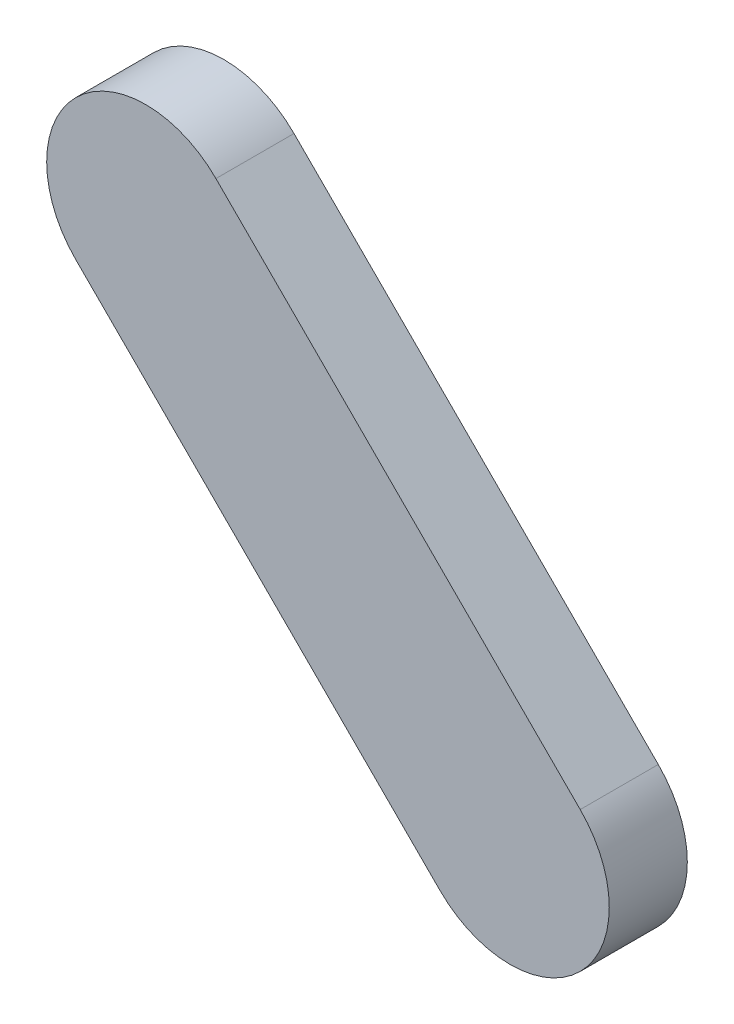
ISO-10303-21;
HEADER;
FILE_DESCRIPTION(('STEP AP214'),'2;1');
FILE_NAME('part.step','',(''),(''),'','','');
FILE_SCHEMA(('AUTOMOTIVE_DESIGN { 1 0 10303 214 1 1 1 1 }'));
ENDSEC;
DATA;
#1=APPLICATION_CONTEXT('core data for automotive mechanical design processes');
#2=APPLICATION_PROTOCOL_DEFINITION('international standard','automotive_design',2000,#1);
#3=PRODUCT_CONTEXT('',#1,'mechanical');
#4=PRODUCT('Part','Part','',(#3));
#5=PRODUCT_RELATED_PRODUCT_CATEGORY('part','',(#4));
#6=PRODUCT_DEFINITION_FORMATION('','',#4);
#7=PRODUCT_DEFINITION_CONTEXT('part definition',#1,'design');
#8=PRODUCT_DEFINITION('design','',#6,#7);
#9=PRODUCT_DEFINITION_SHAPE('','',#8);
#10=(LENGTH_UNIT() NAMED_UNIT(*) SI_UNIT(.MILLI.,.METRE.));
#11=(NAMED_UNIT(*) PLANE_ANGLE_UNIT() SI_UNIT($,.RADIAN.));
#12=(NAMED_UNIT(*) SI_UNIT($,.STERADIAN.) SOLID_ANGLE_UNIT());
#13=UNCERTAINTY_MEASURE_WITH_UNIT(LENGTH_MEASURE(1.E-05),#10,'distance_accuracy_value','');
#14=(GEOMETRIC_REPRESENTATION_CONTEXT(3) GLOBAL_UNCERTAINTY_ASSIGNED_CONTEXT((#13)) GLOBAL_UNIT_ASSIGNED_CONTEXT((#10,
#11,#12)) REPRESENTATION_CONTEXT('',''));
#15=CARTESIAN_POINT('',(0.,0.,0.));
#16=DIRECTION('',(0.,0.,1.));
#17=DIRECTION('',(1.,0.,0.));
#18=AXIS2_PLACEMENT_3D('',#15,#16,#17);
#19=CARTESIAN_POINT('',(150.131907,86.16520486,0.));
#20=DIRECTION('',(0.707106781186548,0.707106781186548,0.));
#21=DIRECTION('',(0.707106781186548,-0.707106781186548,0.));
#22=AXIS2_PLACEMENT_3D('',#19,#20,#21);
#23=PLANE('',#22);
#24=DIRECTION('',(0.707106781186548,-0.707106781186548,0.));
#25=VECTOR('',#24,1.);
#26=CARTESIAN_POINT('',(150.131907,86.16520486,0.1999996));
#27=LINE('',#26,#25);
#28=CARTESIAN_POINT('',(150.131907,86.16520486,0.1999996));
#29=VERTEX_POINT('',#28);
#30=CARTESIAN_POINT('',(151.06520206,85.2319098,0.1999996));
#31=VERTEX_POINT('',#30);
#32=EDGE_CURVE('E11',#29,#31,#27,.T.);
#33=ORIENTED_EDGE('',*,*,#32,.F.);
#34=DIRECTION('',(0.,0.,1.));
#35=VECTOR('',#34,1.);
#36=CARTESIAN_POINT('',(150.131907,86.16520486,0.));
#37=LINE('',#36,#35);
#38=CARTESIAN_POINT('',(150.131907,86.16520486,0.));
#39=VERTEX_POINT('',#38);
#40=EDGE_CURVE('E24',#39,#29,#37,.T.);
#41=ORIENTED_EDGE('',*,*,#40,.F.);
#42=DIRECTION('',(0.707106781186548,-0.707106781186548,0.));
#43=VECTOR('',#42,1.);
#44=CARTESIAN_POINT('',(150.131907,86.16520486,0.));
#45=LINE('',#44,#43);
#46=CARTESIAN_POINT('',(151.06520206,85.2319098,0.));
#47=VERTEX_POINT('',#46);
#48=EDGE_CURVE('E75',#39,#47,#45,.T.);
#49=ORIENTED_EDGE('',*,*,#48,.T.);
#50=DIRECTION('',(0.,0.,1.));
#51=VECTOR('',#50,1.);
#52=CARTESIAN_POINT('',(151.06520206,85.2319098,0.));
#53=LINE('',#52,#51);
#54=EDGE_CURVE('E37',#47,#31,#53,.T.);
#55=ORIENTED_EDGE('',*,*,#54,.T.);
#56=EDGE_LOOP('',(#33,#41,#49,#55));
#57=FACE_BOUND('',#56,.T.);
#58=ADVANCED_FACE('F17',(#57),#23,.F.);
#59=CARTESIAN_POINT('',(151.24480673,85.41151447,0.));
#60=DIRECTION('',(0.,0.,-1.));
#61=DIRECTION('',(-0.707106781186548,-0.707106781186548,0.));
#62=AXIS2_PLACEMENT_3D('',#59,#60,#61);
#63=CYLINDRICAL_SURFACE('',#62,0.253999360179549);
#64=CARTESIAN_POINT('',(151.24480673,85.41151447,0.1999996));
#65=DIRECTION('',(0.,0.,1.));
#66=DIRECTION('',(-0.707106781186548,-0.707106781186548,0.));
#67=AXIS2_PLACEMENT_3D('',#64,#65,#66);
#68=CIRCLE('',#67,0.253999360179549);
#69=CARTESIAN_POINT('',(151.4244114,85.59111914,0.1999996));
#70=VERTEX_POINT('',#69);
#71=EDGE_CURVE('E83',#31,#70,#68,.T.);
#72=ORIENTED_EDGE('',*,*,#71,.F.);
#73=ORIENTED_EDGE('',*,*,#54,.F.);
#74=CARTESIAN_POINT('',(151.24480673,85.41151447,0.));
#75=DIRECTION('',(0.,0.,1.));
#76=DIRECTION('',(-0.707106781186548,-0.707106781186548,0.));
#77=AXIS2_PLACEMENT_3D('',#74,#75,#76);
#78=CIRCLE('',#77,0.253999360179549);
#79=CARTESIAN_POINT('',(151.4244114,85.59111914,0.));
#80=VERTEX_POINT('',#79);
#81=EDGE_CURVE('E81',#47,#80,#78,.T.);
#82=ORIENTED_EDGE('',*,*,#81,.T.);
#83=DIRECTION('',(0.,0.,1.));
#84=VECTOR('',#83,1.);
#85=CARTESIAN_POINT('',(151.4244114,85.59111914,0.));
#86=LINE('',#85,#84);
#87=EDGE_CURVE('E67',#80,#70,#86,.T.);
#88=ORIENTED_EDGE('',*,*,#87,.T.);
#89=EDGE_LOOP('',(#72,#73,#82,#88));
#90=FACE_BOUND('',#89,.T.);
#91=ADVANCED_FACE('F89',(#90),#63,.T.);
#92=CARTESIAN_POINT('',(151.4244114,85.59111914,0.));
#93=DIRECTION('',(-0.707106781186542,-0.707106781186553,0.));
#94=DIRECTION('',(-0.707106781186553,0.707106781186542,0.));
#95=AXIS2_PLACEMENT_3D('',#92,#93,#94);
#96=PLANE('',#95);
#97=DIRECTION('',(-0.707106781186553,0.707106781186542,0.));
#98=VECTOR('',#97,1.);
#99=CARTESIAN_POINT('',(151.4244114,85.59111914,0.1999996));
#100=LINE('',#99,#98);
#101=CARTESIAN_POINT('',(150.49111634,86.5244142,0.1999996));
#102=VERTEX_POINT('',#101);
#103=EDGE_CURVE('E71',#70,#102,#100,.T.);
#104=ORIENTED_EDGE('',*,*,#103,.F.);
#105=ORIENTED_EDGE('',*,*,#87,.F.);
#106=DIRECTION('',(-0.707106781186553,0.707106781186542,0.));
#107=VECTOR('',#106,1.);
#108=CARTESIAN_POINT('',(151.4244114,85.59111914,0.));
#109=LINE('',#108,#107);
#110=CARTESIAN_POINT('',(150.49111634,86.5244142,0.));
#111=VERTEX_POINT('',#110);
#112=EDGE_CURVE('E63',#80,#111,#109,.T.);
#113=ORIENTED_EDGE('',*,*,#112,.T.);
#114=DIRECTION('',(0.,0.,1.));
#115=VECTOR('',#114,1.);
#116=CARTESIAN_POINT('',(150.49111634,86.5244142,0.));
#117=LINE('',#116,#115);
#118=EDGE_CURVE('E53',#111,#102,#117,.T.);
#119=ORIENTED_EDGE('',*,*,#118,.T.);
#120=EDGE_LOOP('',(#104,#105,#113,#119));
#121=FACE_BOUND('',#120,.T.);
#122=ADVANCED_FACE('F66',(#121),#96,.F.);
#123=CARTESIAN_POINT('',(150.31151167,86.34480953,0.));
#124=DIRECTION('',(0.,0.,-1.));
#125=DIRECTION('',(0.707106781186548,0.707106781186548,0.));
#126=AXIS2_PLACEMENT_3D('',#123,#124,#125);
#127=CYLINDRICAL_SURFACE('',#126,0.253999360179546);
#128=CARTESIAN_POINT('',(150.31151167,86.34480953,0.1999996));
#129=DIRECTION('',(0.,0.,1.));
#130=DIRECTION('',(0.707106781186548,0.707106781186548,0.));
#131=AXIS2_PLACEMENT_3D('',#128,#129,#130);
#132=CIRCLE('',#131,0.253999360179546);
#133=EDGE_CURVE('E59',#102,#29,#132,.T.);
#134=ORIENTED_EDGE('',*,*,#133,.F.);
#135=ORIENTED_EDGE('',*,*,#118,.F.);
#136=CARTESIAN_POINT('',(150.31151167,86.34480953,0.));
#137=DIRECTION('',(0.,0.,1.));
#138=DIRECTION('',(0.707106781186548,0.707106781186548,0.));
#139=AXIS2_PLACEMENT_3D('',#136,#137,#138);
#140=CIRCLE('',#139,0.253999360179546);
#141=EDGE_CURVE('E57',#111,#39,#140,.T.);
#142=ORIENTED_EDGE('',*,*,#141,.T.);
#143=ORIENTED_EDGE('',*,*,#40,.T.);
#144=EDGE_LOOP('',(#134,#135,#142,#143));
#145=FACE_BOUND('',#144,.T.);
#146=ADVANCED_FACE('F55',(#145),#127,.T.);
#147=CARTESIAN_POINT('',(150.131907,86.16520486,0.));
#148=DIRECTION('',(0.,0.,-1.));
#149=DIRECTION('',(-1.,0.,0.));
#150=AXIS2_PLACEMENT_3D('',#147,#148,#149);
#151=PLANE('',#150);
#152=ORIENTED_EDGE('',*,*,#141,.F.);
#153=ORIENTED_EDGE('',*,*,#112,.F.);
#154=ORIENTED_EDGE('',*,*,#81,.F.);
#155=ORIENTED_EDGE('',*,*,#48,.F.);
#156=EDGE_LOOP('',(#152,#153,#154,#155));
#157=FACE_BOUND('',#156,.T.);
#158=ADVANCED_FACE('F74',(#157),#151,.T.);
#159=CARTESIAN_POINT('',(150.131907,86.16520486,0.1999996));
#160=DIRECTION('',(0.,0.,-1.));
#161=DIRECTION('',(-1.,0.,0.));
#162=AXIS2_PLACEMENT_3D('',#159,#160,#161);
#163=PLANE('',#162);
#164=ORIENTED_EDGE('',*,*,#32,.T.);
#165=ORIENTED_EDGE('',*,*,#71,.T.);
#166=ORIENTED_EDGE('',*,*,#103,.T.);
#167=ORIENTED_EDGE('',*,*,#133,.T.);
#168=EDGE_LOOP('',(#164,#165,#166,#167));
#169=FACE_BOUND('',#168,.T.);
#170=ADVANCED_FACE('F91',(#169),#163,.F.);
#171=CLOSED_SHELL('',(#58,#91,#122,#146,#158,#170));
#172=MANIFOLD_SOLID_BREP('B1',#171);
#173=ADVANCED_BREP_SHAPE_REPRESENTATION('',(#18,#172),#14);
#174=SHAPE_DEFINITION_REPRESENTATION(#9,#173);
ENDSEC;
END-ISO-10303-21;
